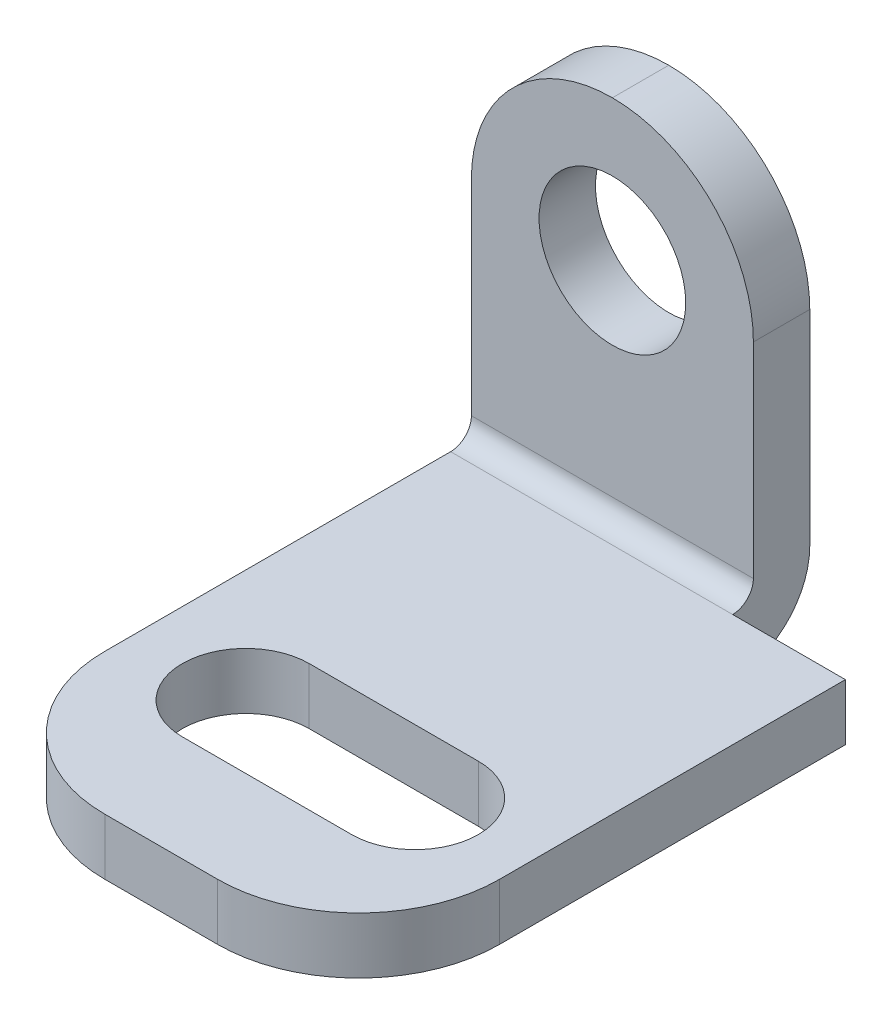
ISO-10303-21;
HEADER;
FILE_DESCRIPTION(('STEP AP214'),'2;1');
FILE_NAME('part.step','',(''),(''),'','','');
FILE_SCHEMA(('AUTOMOTIVE_DESIGN { 1 0 10303 214 1 1 1 1 }'));
ENDSEC;
DATA;
#1=APPLICATION_CONTEXT('core data for automotive mechanical design processes');
#2=APPLICATION_PROTOCOL_DEFINITION('international standard','automotive_design',2000,#1);
#3=PRODUCT_CONTEXT('',#1,'mechanical');
#4=PRODUCT('Part','Part','',(#3));
#5=PRODUCT_RELATED_PRODUCT_CATEGORY('part','',(#4));
#6=PRODUCT_DEFINITION_FORMATION('','',#4);
#7=PRODUCT_DEFINITION_CONTEXT('part definition',#1,'design');
#8=PRODUCT_DEFINITION('design','',#6,#7);
#9=PRODUCT_DEFINITION_SHAPE('','',#8);
#10=(LENGTH_UNIT() NAMED_UNIT(*) SI_UNIT(.MILLI.,.METRE.));
#11=(NAMED_UNIT(*) PLANE_ANGLE_UNIT() SI_UNIT($,.RADIAN.));
#12=(NAMED_UNIT(*) SI_UNIT($,.STERADIAN.) SOLID_ANGLE_UNIT());
#13=UNCERTAINTY_MEASURE_WITH_UNIT(LENGTH_MEASURE(1.E-05),#10,'distance_accuracy_value','');
#14=(GEOMETRIC_REPRESENTATION_CONTEXT(3) GLOBAL_UNCERTAINTY_ASSIGNED_CONTEXT((#13)) GLOBAL_UNIT_ASSIGNED_CONTEXT((#10,
#11,#12)) REPRESENTATION_CONTEXT('',''));
#15=CARTESIAN_POINT('',(0.,0.,0.));
#16=DIRECTION('',(0.,0.,1.));
#17=DIRECTION('',(1.,0.,0.));
#18=AXIS2_PLACEMENT_3D('',#15,#16,#17);
#19=CARTESIAN_POINT('',(7.,2.7366,2.));
#20=DIRECTION('',(1.,0.,0.));
#21=DIRECTION('',(0.,0.,-1.));
#22=AXIS2_PLACEMENT_3D('',#19,#20,#21);
#23=PLANE('',#22);
#24=DIRECTION('',(0.,0.,-1.));
#25=VECTOR('',#24,1.);
#26=CARTESIAN_POINT('',(7.,2.,20.));
#27=LINE('',#26,#25);
#28=CARTESIAN_POINT('',(7.,2.,15.));
#29=VERTEX_POINT('',#28);
#30=CARTESIAN_POINT('',(7.,2.,2.7366));
#31=VERTEX_POINT('',#30);
#32=EDGE_CURVE('E154',#29,#31,#27,.T.);
#33=ORIENTED_EDGE('',*,*,#32,.F.);
#34=DIRECTION('',(0.,1.,0.));
#35=VECTOR('',#34,1.);
#36=CARTESIAN_POINT('',(7.,2.7366,15.));
#37=LINE('',#36,#35);
#38=CARTESIAN_POINT('',(7.,0.,15.));
#39=VERTEX_POINT('',#38);
#40=EDGE_CURVE('E43',#29,#39,#37,.F.);
#41=ORIENTED_EDGE('',*,*,#40,.T.);
#42=DIRECTION('',(0.,0.,-1.));
#43=VECTOR('',#42,1.);
#44=CARTESIAN_POINT('',(7.,0.,20.));
#45=LINE('',#44,#43);
#46=CARTESIAN_POINT('',(7.,0.,2.7366));
#47=VERTEX_POINT('',#46);
#48=EDGE_CURVE('E147',#39,#47,#45,.T.);
#49=ORIENTED_EDGE('',*,*,#48,.T.);
#50=DIRECTION('',(0.,1.,0.));
#51=VECTOR('',#50,1.);
#52=CARTESIAN_POINT('',(7.,0.,2.7366));
#53=LINE('',#52,#51);
#54=EDGE_CURVE('E149',#47,#31,#53,.T.);
#55=ORIENTED_EDGE('',*,*,#54,.T.);
#56=EDGE_LOOP('',(#33,#41,#49,#55));
#57=FACE_BOUND('',#56,.T.);
#58=ADVANCED_FACE('F34',(#57),#23,.T.);
#59=CARTESIAN_POINT('',(-7.,2.7366,0.));
#60=DIRECTION('',(-1.,0.,0.));
#61=DIRECTION('',(0.,0.,1.));
#62=AXIS2_PLACEMENT_3D('',#59,#60,#61);
#63=PLANE('',#62);
#64=DIRECTION('',(0.,0.,1.));
#65=VECTOR('',#64,1.);
#66=CARTESIAN_POINT('',(-7.,2.7366,0.));
#67=LINE('',#66,#65);
#68=CARTESIAN_POINT('',(-7.,2.7366,0.));
#69=VERTEX_POINT('',#68);
#70=CARTESIAN_POINT('',(-7.,2.7366,2.));
#71=VERTEX_POINT('',#70);
#72=EDGE_CURVE('E166',#69,#71,#67,.T.);
#73=ORIENTED_EDGE('',*,*,#72,.F.);
#74=CARTESIAN_POINT('',(-7.,2.7366,2.7366));
#75=DIRECTION('',(-1.,0.,0.));
#76=DIRECTION('',(0.,0.,1.));
#77=AXIS2_PLACEMENT_3D('',#74,#75,#76);
#78=CIRCLE('',#77,2.7366);
#79=CARTESIAN_POINT('',(-7.,0.,2.7366));
#80=VERTEX_POINT('',#79);
#81=EDGE_CURVE('E226',#80,#69,#78,.F.);
#82=ORIENTED_EDGE('',*,*,#81,.F.);
#83=DIRECTION('',(0.,-1.,0.));
#84=VECTOR('',#83,1.);
#85=CARTESIAN_POINT('',(-7.,2.,2.7366));
#86=LINE('',#85,#84);
#87=CARTESIAN_POINT('',(-7.,2.,2.7366));
#88=VERTEX_POINT('',#87);
#89=EDGE_CURVE('E184',#88,#80,#86,.T.);
#90=ORIENTED_EDGE('',*,*,#89,.F.);
#91=CARTESIAN_POINT('',(-7.,2.7366,2.7366));
#92=DIRECTION('',(1.,0.,0.));
#93=DIRECTION('',(0.,0.,-1.));
#94=AXIS2_PLACEMENT_3D('',#91,#92,#93);
#95=CIRCLE('',#94,0.7366);
#96=EDGE_CURVE('E250',#88,#71,#95,.T.);
#97=ORIENTED_EDGE('',*,*,#96,.T.);
#98=EDGE_LOOP('',(#73,#82,#90,#97));
#99=FACE_BOUND('',#98,.T.);
#100=ADVANCED_FACE('F259',(#99),#63,.T.);
#101=CARTESIAN_POINT('',(-7.,2.,2.7366));
#102=DIRECTION('',(-1.,0.,0.));
#103=DIRECTION('',(0.,0.,1.));
#104=AXIS2_PLACEMENT_3D('',#101,#102,#103);
#105=PLANE('',#104);
#106=DIRECTION('',(0.,1.,0.));
#107=VECTOR('',#106,1.);
#108=CARTESIAN_POINT('',(-7.,0.,2.));
#109=LINE('',#108,#107);
#110=CARTESIAN_POINT('',(-7.,10.,2.));
#111=VERTEX_POINT('',#110);
#112=EDGE_CURVE('E246',#71,#111,#109,.T.);
#113=ORIENTED_EDGE('',*,*,#112,.T.);
#114=DIRECTION('',(0.,0.,-1.));
#115=VECTOR('',#114,1.);
#116=CARTESIAN_POINT('',(-7.,10.,2.7366));
#117=LINE('',#116,#115);
#118=CARTESIAN_POINT('',(-7.,10.,0.));
#119=VERTEX_POINT('',#118);
#120=EDGE_CURVE('E190',#111,#119,#117,.T.);
#121=ORIENTED_EDGE('',*,*,#120,.T.);
#122=DIRECTION('',(0.,1.,0.));
#123=VECTOR('',#122,1.);
#124=CARTESIAN_POINT('',(-7.,0.,0.));
#125=LINE('',#124,#123);
#126=EDGE_CURVE('E243',#69,#119,#125,.T.);
#127=ORIENTED_EDGE('',*,*,#126,.F.);
#128=ORIENTED_EDGE('',*,*,#72,.T.);
#129=EDGE_LOOP('',(#113,#121,#127,#128));
#130=FACE_BOUND('',#129,.T.);
#131=ADVANCED_FACE('F268',(#130),#105,.T.);
#132=CARTESIAN_POINT('',(7.,0.,0.));
#133=DIRECTION('',(0.,0.,1.));
#134=DIRECTION('',(1.,0.,0.));
#135=AXIS2_PLACEMENT_3D('',#132,#133,#134);
#136=PLANE('',#135);
#137=CARTESIAN_POINT('',(-2.,10.,0.));
#138=DIRECTION('',(0.,0.,1.));
#139=DIRECTION('',(1.,0.,0.));
#140=AXIS2_PLACEMENT_3D('',#137,#138,#139);
#141=CIRCLE('',#140,2.6);
#142=CARTESIAN_POINT('',(0.599999999999999,10.,0.));
#143=VERTEX_POINT('',#142);
#144=EDGE_CURVE('E549',#143,#143,#141,.T.);
#145=ORIENTED_EDGE('',*,*,#144,.T.);
#146=EDGE_LOOP('',(#145));
#147=FACE_BOUND('',#146,.T.);
#148=ORIENTED_EDGE('',*,*,#126,.T.);
#149=CARTESIAN_POINT('',(-2.,10.,0.));
#150=DIRECTION('',(0.,0.,1.));
#151=DIRECTION('',(1.,0.,0.));
#152=AXIS2_PLACEMENT_3D('',#149,#150,#151);
#153=CIRCLE('',#152,5.);
#154=CARTESIAN_POINT('',(-2.,15.,0.));
#155=VERTEX_POINT('',#154);
#156=EDGE_CURVE('E195',#119,#155,#153,.F.);
#157=ORIENTED_EDGE('',*,*,#156,.T.);
#158=CARTESIAN_POINT('',(-2.,10.,0.));
#159=DIRECTION('',(0.,0.,1.));
#160=DIRECTION('',(1.,0.,0.));
#161=AXIS2_PLACEMENT_3D('',#158,#159,#160);
#162=CIRCLE('',#161,5.);
#163=CARTESIAN_POINT('',(3.,10.,0.));
#164=VERTEX_POINT('',#163);
#165=EDGE_CURVE('E193',#155,#164,#162,.F.);
#166=ORIENTED_EDGE('',*,*,#165,.T.);
#167=DIRECTION('',(0.,-1.,0.));
#168=VECTOR('',#167,1.);
#169=CARTESIAN_POINT('',(3.,15.,0.));
#170=LINE('',#169,#168);
#171=CARTESIAN_POINT('',(3.,2.7366,0.));
#172=VERTEX_POINT('',#171);
#173=EDGE_CURVE('E282',#164,#172,#170,.T.);
#174=ORIENTED_EDGE('',*,*,#173,.T.);
#175=DIRECTION('',(-1.,0.,0.));
#176=VECTOR('',#175,1.);
#177=CARTESIAN_POINT('',(7.,2.7366,0.));
#178=LINE('',#177,#176);
#179=EDGE_CURVE('E153',#172,#69,#178,.T.);
#180=ORIENTED_EDGE('',*,*,#179,.T.);
#181=EDGE_LOOP('',(#148,#157,#166,#174,#180));
#182=FACE_BOUND('',#181,.T.);
#183=ADVANCED_FACE('F278',(#147,#182),#136,.F.);
#184=CARTESIAN_POINT('',(7.,0.,2.));
#185=DIRECTION('',(0.,0.,1.));
#186=DIRECTION('',(1.,0.,0.));
#187=AXIS2_PLACEMENT_3D('',#184,#185,#186);
#188=PLANE('',#187);
#189=CARTESIAN_POINT('',(-2.,10.,2.));
#190=DIRECTION('',(0.,0.,1.));
#191=DIRECTION('',(1.,0.,0.));
#192=AXIS2_PLACEMENT_3D('',#189,#190,#191);
#193=CIRCLE('',#192,2.6);
#194=CARTESIAN_POINT('',(0.599999999999999,10.,2.));
#195=VERTEX_POINT('',#194);
#196=EDGE_CURVE('E548',#195,#195,#193,.T.);
#197=ORIENTED_EDGE('',*,*,#196,.F.);
#198=EDGE_LOOP('',(#197));
#199=FACE_BOUND('',#198,.T.);
#200=CARTESIAN_POINT('',(-2.,10.,2.));
#201=DIRECTION('',(0.,0.,1.));
#202=DIRECTION('',(1.,0.,0.));
#203=AXIS2_PLACEMENT_3D('',#200,#201,#202);
#204=CIRCLE('',#203,5.);
#205=CARTESIAN_POINT('',(3.,10.,2.));
#206=VERTEX_POINT('',#205);
#207=CARTESIAN_POINT('',(-2.,15.,2.));
#208=VERTEX_POINT('',#207);
#209=EDGE_CURVE('E197',#206,#208,#204,.T.);
#210=ORIENTED_EDGE('',*,*,#209,.T.);
#211=CARTESIAN_POINT('',(-2.,10.,2.));
#212=DIRECTION('',(0.,0.,1.));
#213=DIRECTION('',(1.,0.,0.));
#214=AXIS2_PLACEMENT_3D('',#211,#212,#213);
#215=CIRCLE('',#214,5.);
#216=EDGE_CURVE('E199',#208,#111,#215,.T.);
#217=ORIENTED_EDGE('',*,*,#216,.T.);
#218=ORIENTED_EDGE('',*,*,#112,.F.);
#219=DIRECTION('',(-1.,0.,0.));
#220=VECTOR('',#219,1.);
#221=CARTESIAN_POINT('',(7.,2.7366,2.));
#222=LINE('',#221,#220);
#223=CARTESIAN_POINT('',(3.,2.7366,2.));
#224=VERTEX_POINT('',#223);
#225=EDGE_CURVE('E182',#224,#71,#222,.T.);
#226=ORIENTED_EDGE('',*,*,#225,.F.);
#227=DIRECTION('',(0.,-1.,0.));
#228=VECTOR('',#227,1.);
#229=CARTESIAN_POINT('',(3.,0.,2.));
#230=LINE('',#229,#228);
#231=EDGE_CURVE('E291',#206,#224,#230,.T.);
#232=ORIENTED_EDGE('',*,*,#231,.F.);
#233=EDGE_LOOP('',(#210,#217,#218,#226,#232));
#234=FACE_BOUND('',#233,.T.);
#235=ADVANCED_FACE('F270',(#199,#234),#188,.T.);
#236=CARTESIAN_POINT('',(7.,2.7366,2.7366));
#237=DIRECTION('',(-1.,0.,0.));
#238=DIRECTION('',(0.,0.,1.));
#239=AXIS2_PLACEMENT_3D('',#236,#237,#238);
#240=CYLINDRICAL_SURFACE('',#239,0.7366);
#241=CARTESIAN_POINT('',(3.,2.7366,2.7366));
#242=DIRECTION('',(-1.,0.,0.));
#243=DIRECTION('',(0.,0.,1.));
#244=AXIS2_PLACEMENT_3D('',#241,#242,#243);
#245=CIRCLE('',#244,0.7366);
#246=CARTESIAN_POINT('',(3.,2.,2.7366));
#247=VERTEX_POINT('',#246);
#248=EDGE_CURVE('E262',#224,#247,#245,.T.);
#249=ORIENTED_EDGE('',*,*,#248,.F.);
#250=ORIENTED_EDGE('',*,*,#225,.T.);
#251=ORIENTED_EDGE('',*,*,#96,.F.);
#252=DIRECTION('',(-1.,0.,0.));
#253=VECTOR('',#252,1.);
#254=CARTESIAN_POINT('',(7.,2.,2.7366));
#255=LINE('',#254,#253);
#256=EDGE_CURVE('E180',#247,#88,#255,.T.);
#257=ORIENTED_EDGE('',*,*,#256,.F.);
#258=EDGE_LOOP('',(#249,#250,#251,#257));
#259=FACE_BOUND('',#258,.T.);
#260=ADVANCED_FACE('F260',(#259),#240,.F.);
#261=CARTESIAN_POINT('',(7.,2.,20.));
#262=DIRECTION('',(0.,1.,0.));
#263=DIRECTION('',(0.,0.,1.));
#264=AXIS2_PLACEMENT_3D('',#261,#262,#263);
#265=PLANE('',#264);
#266=CARTESIAN_POINT('',(-3.,2.,14.));
#267=DIRECTION('',(0.,1.,0.));
#268=DIRECTION('',(0.,0.,1.));
#269=AXIS2_PLACEMENT_3D('',#266,#267,#268);
#270=CIRCLE('',#269,2.25);
#271=CARTESIAN_POINT('',(-3.,2.,11.75));
#272=VERTEX_POINT('',#271);
#273=CARTESIAN_POINT('',(-3.,2.,16.25));
#274=VERTEX_POINT('',#273);
#275=EDGE_CURVE('E297',#272,#274,#270,.T.);
#276=ORIENTED_EDGE('',*,*,#275,.F.);
#277=DIRECTION('',(-1.,0.,0.));
#278=VECTOR('',#277,1.);
#279=CARTESIAN_POINT('',(-3.,2.,11.75));
#280=LINE('',#279,#278);
#281=CARTESIAN_POINT('',(3.,2.,11.75));
#282=VERTEX_POINT('',#281);
#283=EDGE_CURVE('E302',#282,#272,#280,.T.);
#284=ORIENTED_EDGE('',*,*,#283,.F.);
#285=CARTESIAN_POINT('',(3.,2.,14.));
#286=DIRECTION('',(0.,1.,0.));
#287=DIRECTION('',(0.,0.,1.));
#288=AXIS2_PLACEMENT_3D('',#285,#286,#287);
#289=CIRCLE('',#288,2.25);
#290=CARTESIAN_POINT('',(3.,2.,16.25));
#291=VERTEX_POINT('',#290);
#292=EDGE_CURVE('E315',#291,#282,#289,.T.);
#293=ORIENTED_EDGE('',*,*,#292,.F.);
#294=DIRECTION('',(1.,0.,0.));
#295=VECTOR('',#294,1.);
#296=CARTESIAN_POINT('',(-3.,2.,16.25));
#297=LINE('',#296,#295);
#298=EDGE_CURVE('E312',#274,#291,#297,.T.);
#299=ORIENTED_EDGE('',*,*,#298,.F.);
#300=EDGE_LOOP('',(#276,#284,#293,#299));
#301=FACE_BOUND('',#300,.T.);
#302=DIRECTION('',(0.,0.,-1.));
#303=VECTOR('',#302,1.);
#304=CARTESIAN_POINT('',(-7.,2.,20.));
#305=LINE('',#304,#303);
#306=CARTESIAN_POINT('',(-7.,2.,15.));
#307=VERTEX_POINT('',#306);
#308=EDGE_CURVE('E227',#307,#88,#305,.T.);
#309=ORIENTED_EDGE('',*,*,#308,.F.);
#310=CARTESIAN_POINT('',(-2.,2.,15.));
#311=DIRECTION('',(0.,1.,0.));
#312=DIRECTION('',(0.,0.,1.));
#313=AXIS2_PLACEMENT_3D('',#310,#311,#312);
#314=CIRCLE('',#313,5.);
#315=CARTESIAN_POINT('',(-2.,2.,20.));
#316=VERTEX_POINT('',#315);
#317=EDGE_CURVE('E206',#307,#316,#314,.T.);
#318=ORIENTED_EDGE('',*,*,#317,.T.);
#319=DIRECTION('',(-1.,0.,0.));
#320=VECTOR('',#319,1.);
#321=CARTESIAN_POINT('',(7.,2.,20.));
#322=LINE('',#321,#320);
#323=CARTESIAN_POINT('',(2.,2.,20.));
#324=VERTEX_POINT('',#323);
#325=EDGE_CURVE('E174',#324,#316,#322,.T.);
#326=ORIENTED_EDGE('',*,*,#325,.F.);
#327=CARTESIAN_POINT('',(2.,2.,15.));
#328=DIRECTION('',(0.,1.,0.));
#329=DIRECTION('',(0.,0.,1.));
#330=AXIS2_PLACEMENT_3D('',#327,#328,#329);
#331=CIRCLE('',#330,5.);
#332=EDGE_CURVE('E204',#324,#29,#331,.T.);
#333=ORIENTED_EDGE('',*,*,#332,.T.);
#334=ORIENTED_EDGE('',*,*,#32,.T.);
#335=EDGE_CURVE('E164',#31,#247,#255,.T.);
#336=ORIENTED_EDGE('',*,*,#335,.T.);
#337=ORIENTED_EDGE('',*,*,#256,.T.);
#338=EDGE_LOOP('',(#309,#318,#326,#333,#334,#336,#337));
#339=FACE_BOUND('',#338,.T.);
#340=ADVANCED_FACE('F232',(#301,#339),#265,.T.);
#341=CARTESIAN_POINT('',(7.,0.,20.));
#342=DIRECTION('',(0.,0.,1.));
#343=DIRECTION('',(1.,0.,0.));
#344=AXIS2_PLACEMENT_3D('',#341,#342,#343);
#345=PLANE('',#344);
#346=ORIENTED_EDGE('',*,*,#325,.T.);
#347=DIRECTION('',(0.,1.,0.));
#348=VECTOR('',#347,1.);
#349=CARTESIAN_POINT('',(-2.,0.,20.));
#350=LINE('',#349,#348);
#351=CARTESIAN_POINT('',(-2.,0.,20.));
#352=VERTEX_POINT('',#351);
#353=EDGE_CURVE('E57',#316,#352,#350,.F.);
#354=ORIENTED_EDGE('',*,*,#353,.T.);
#355=DIRECTION('',(-1.,0.,0.));
#356=VECTOR('',#355,1.);
#357=CARTESIAN_POINT('',(7.,0.,20.));
#358=LINE('',#357,#356);
#359=CARTESIAN_POINT('',(2.,0.,20.));
#360=VERTEX_POINT('',#359);
#361=EDGE_CURVE('E172',#360,#352,#358,.T.);
#362=ORIENTED_EDGE('',*,*,#361,.F.);
#363=DIRECTION('',(0.,1.,0.));
#364=VECTOR('',#363,1.);
#365=CARTESIAN_POINT('',(2.,0.,20.));
#366=LINE('',#365,#364);
#367=EDGE_CURVE('E208',#360,#324,#366,.T.);
#368=ORIENTED_EDGE('',*,*,#367,.T.);
#369=EDGE_LOOP('',(#346,#354,#362,#368));
#370=FACE_BOUND('',#369,.T.);
#371=ADVANCED_FACE('F234',(#370),#345,.T.);
#372=CARTESIAN_POINT('',(7.,0.,20.));
#373=DIRECTION('',(0.,1.,0.));
#374=DIRECTION('',(0.,0.,1.));
#375=AXIS2_PLACEMENT_3D('',#372,#373,#374);
#376=PLANE('',#375);
#377=DIRECTION('',(-1.,0.,0.));
#378=VECTOR('',#377,1.);
#379=CARTESIAN_POINT('',(-3.,0.,11.75));
#380=LINE('',#379,#378);
#381=CARTESIAN_POINT('',(3.,0.,11.75));
#382=VERTEX_POINT('',#381);
#383=CARTESIAN_POINT('',(-3.,0.,11.75));
#384=VERTEX_POINT('',#383);
#385=EDGE_CURVE('E308',#382,#384,#380,.T.);
#386=ORIENTED_EDGE('',*,*,#385,.T.);
#387=CARTESIAN_POINT('',(-3.,0.,14.));
#388=DIRECTION('',(0.,1.,0.));
#389=DIRECTION('',(0.,0.,1.));
#390=AXIS2_PLACEMENT_3D('',#387,#388,#389);
#391=CIRCLE('',#390,2.25);
#392=CARTESIAN_POINT('',(-3.,0.,16.25));
#393=VERTEX_POINT('',#392);
#394=EDGE_CURVE('E298',#384,#393,#391,.T.);
#395=ORIENTED_EDGE('',*,*,#394,.T.);
#396=DIRECTION('',(1.,0.,0.));
#397=VECTOR('',#396,1.);
#398=CARTESIAN_POINT('',(-3.,0.,16.25));
#399=LINE('',#398,#397);
#400=CARTESIAN_POINT('',(3.,0.,16.25));
#401=VERTEX_POINT('',#400);
#402=EDGE_CURVE('E301',#393,#401,#399,.T.);
#403=ORIENTED_EDGE('',*,*,#402,.T.);
#404=CARTESIAN_POINT('',(3.,0.,14.));
#405=DIRECTION('',(0.,1.,0.));
#406=DIRECTION('',(0.,0.,1.));
#407=AXIS2_PLACEMENT_3D('',#404,#405,#406);
#408=CIRCLE('',#407,2.25);
#409=EDGE_CURVE('E305',#401,#382,#408,.T.);
#410=ORIENTED_EDGE('',*,*,#409,.T.);
#411=EDGE_LOOP('',(#386,#395,#403,#410));
#412=FACE_BOUND('',#411,.T.);
#413=ORIENTED_EDGE('',*,*,#361,.T.);
#414=CARTESIAN_POINT('',(-2.,0.,15.));
#415=DIRECTION('',(0.,1.,0.));
#416=DIRECTION('',(0.,0.,1.));
#417=AXIS2_PLACEMENT_3D('',#414,#415,#416);
#418=CIRCLE('',#417,5.);
#419=CARTESIAN_POINT('',(-7.,0.,15.));
#420=VERTEX_POINT('',#419);
#421=EDGE_CURVE('E214',#352,#420,#418,.F.);
#422=ORIENTED_EDGE('',*,*,#421,.T.);
#423=DIRECTION('',(0.,0.,-1.));
#424=VECTOR('',#423,1.);
#425=CARTESIAN_POINT('',(-7.,0.,20.));
#426=LINE('',#425,#424);
#427=EDGE_CURVE('E218',#420,#80,#426,.T.);
#428=ORIENTED_EDGE('',*,*,#427,.T.);
#429=DIRECTION('',(-1.,0.,0.));
#430=VECTOR('',#429,1.);
#431=CARTESIAN_POINT('',(7.,0.,2.7366));
#432=LINE('',#431,#430);
#433=CARTESIAN_POINT('',(3.,0.,2.7366));
#434=VERTEX_POINT('',#433);
#435=EDGE_CURVE('E171',#434,#80,#432,.T.);
#436=ORIENTED_EDGE('',*,*,#435,.F.);
#437=EDGE_CURVE('E161',#47,#434,#432,.T.);
#438=ORIENTED_EDGE('',*,*,#437,.F.);
#439=ORIENTED_EDGE('',*,*,#48,.F.);
#440=CARTESIAN_POINT('',(2.,0.,15.));
#441=DIRECTION('',(0.,1.,0.));
#442=DIRECTION('',(0.,0.,1.));
#443=AXIS2_PLACEMENT_3D('',#440,#441,#442);
#444=CIRCLE('',#443,5.);
#445=EDGE_CURVE('E212',#39,#360,#444,.F.);
#446=ORIENTED_EDGE('',*,*,#445,.T.);
#447=EDGE_LOOP('',(#413,#422,#428,#436,#438,#439,#446));
#448=FACE_BOUND('',#447,.T.);
#449=ADVANCED_FACE('F169',(#412,#448),#376,.F.);
#450=CARTESIAN_POINT('',(7.,2.7366,2.7366));
#451=DIRECTION('',(-1.,0.,0.));
#452=DIRECTION('',(0.,0.,1.));
#453=AXIS2_PLACEMENT_3D('',#450,#451,#452);
#454=CYLINDRICAL_SURFACE('',#453,2.7366);
#455=ORIENTED_EDGE('',*,*,#179,.F.);
#456=CARTESIAN_POINT('',(3.,2.7366,2.7366));
#457=DIRECTION('',(-1.,0.,0.));
#458=DIRECTION('',(0.,0.,1.));
#459=AXIS2_PLACEMENT_3D('',#456,#457,#458);
#460=CIRCLE('',#459,2.7366);
#461=EDGE_CURVE('E165',#172,#434,#460,.T.);
#462=ORIENTED_EDGE('',*,*,#461,.T.);
#463=ORIENTED_EDGE('',*,*,#435,.T.);
#464=ORIENTED_EDGE('',*,*,#81,.T.);
#465=EDGE_LOOP('',(#455,#462,#463,#464));
#466=FACE_BOUND('',#465,.T.);
#467=ADVANCED_FACE('F285',(#466),#454,.T.);
#468=CARTESIAN_POINT('',(-7.,2.7366,2.7366));
#469=DIRECTION('',(1.,0.,0.));
#470=DIRECTION('',(0.,0.,-1.));
#471=AXIS2_PLACEMENT_3D('',#468,#469,#470);
#472=PLANE('',#471);
#473=ORIENTED_EDGE('',*,*,#427,.F.);
#474=DIRECTION('',(0.,1.,0.));
#475=VECTOR('',#474,1.);
#476=CARTESIAN_POINT('',(-7.,2.,15.));
#477=LINE('',#476,#475);
#478=EDGE_CURVE('E201',#420,#307,#477,.T.);
#479=ORIENTED_EDGE('',*,*,#478,.T.);
#480=ORIENTED_EDGE('',*,*,#308,.T.);
#481=ORIENTED_EDGE('',*,*,#89,.T.);
#482=EDGE_LOOP('',(#473,#479,#480,#481));
#483=FACE_BOUND('',#482,.T.);
#484=ADVANCED_FACE('F222',(#483),#472,.F.);
#485=CARTESIAN_POINT('',(-3.,0.,14.));
#486=DIRECTION('',(0.,1.,0.));
#487=DIRECTION('',(0.,0.,1.));
#488=AXIS2_PLACEMENT_3D('',#485,#486,#487);
#489=CYLINDRICAL_SURFACE('',#488,2.25);
#490=ORIENTED_EDGE('',*,*,#275,.T.);
#491=DIRECTION('',(0.,1.,0.));
#492=VECTOR('',#491,1.);
#493=CARTESIAN_POINT('',(-3.,0.,16.25));
#494=LINE('',#493,#492);
#495=EDGE_CURVE('E240',#393,#274,#494,.T.);
#496=ORIENTED_EDGE('',*,*,#495,.F.);
#497=ORIENTED_EDGE('',*,*,#394,.F.);
#498=DIRECTION('',(0.,1.,0.));
#499=VECTOR('',#498,1.);
#500=CARTESIAN_POINT('',(-3.,0.,11.75));
#501=LINE('',#500,#499);
#502=EDGE_CURVE('E247',#384,#272,#501,.T.);
#503=ORIENTED_EDGE('',*,*,#502,.T.);
#504=EDGE_LOOP('',(#490,#496,#497,#503));
#505=FACE_BOUND('',#504,.T.);
#506=ADVANCED_FACE('F341',(#505),#489,.F.);
#507=CARTESIAN_POINT('',(-3.,0.,11.75));
#508=DIRECTION('',(0.,0.,-1.));
#509=DIRECTION('',(-1.,0.,0.));
#510=AXIS2_PLACEMENT_3D('',#507,#508,#509);
#511=PLANE('',#510);
#512=ORIENTED_EDGE('',*,*,#283,.T.);
#513=ORIENTED_EDGE('',*,*,#502,.F.);
#514=ORIENTED_EDGE('',*,*,#385,.F.);
#515=DIRECTION('',(0.,1.,0.));
#516=VECTOR('',#515,1.);
#517=CARTESIAN_POINT('',(3.,0.,11.75));
#518=LINE('',#517,#516);
#519=EDGE_CURVE('E321',#382,#282,#518,.T.);
#520=ORIENTED_EDGE('',*,*,#519,.T.);
#521=EDGE_LOOP('',(#512,#513,#514,#520));
#522=FACE_BOUND('',#521,.T.);
#523=ADVANCED_FACE('F339',(#522),#511,.F.);
#524=CARTESIAN_POINT('',(3.,0.,14.));
#525=DIRECTION('',(0.,1.,0.));
#526=DIRECTION('',(0.,0.,1.));
#527=AXIS2_PLACEMENT_3D('',#524,#525,#526);
#528=CYLINDRICAL_SURFACE('',#527,2.25);
#529=ORIENTED_EDGE('',*,*,#292,.T.);
#530=ORIENTED_EDGE('',*,*,#519,.F.);
#531=ORIENTED_EDGE('',*,*,#409,.F.);
#532=DIRECTION('',(0.,1.,0.));
#533=VECTOR('',#532,1.);
#534=CARTESIAN_POINT('',(3.,0.,16.25));
#535=LINE('',#534,#533);
#536=EDGE_CURVE('E322',#401,#291,#535,.T.);
#537=ORIENTED_EDGE('',*,*,#536,.T.);
#538=EDGE_LOOP('',(#529,#530,#531,#537));
#539=FACE_BOUND('',#538,.T.);
#540=ADVANCED_FACE('F336',(#539),#528,.F.);
#541=CARTESIAN_POINT('',(-3.,0.,16.25));
#542=DIRECTION('',(0.,0.,1.));
#543=DIRECTION('',(1.,0.,0.));
#544=AXIS2_PLACEMENT_3D('',#541,#542,#543);
#545=PLANE('',#544);
#546=ORIENTED_EDGE('',*,*,#298,.T.);
#547=ORIENTED_EDGE('',*,*,#536,.F.);
#548=ORIENTED_EDGE('',*,*,#402,.F.);
#549=ORIENTED_EDGE('',*,*,#495,.T.);
#550=EDGE_LOOP('',(#546,#547,#548,#549));
#551=FACE_BOUND('',#550,.T.);
#552=ADVANCED_FACE('F329',(#551),#545,.F.);
#553=CARTESIAN_POINT('',(3.,0.,0.));
#554=DIRECTION('',(-1.,0.,0.));
#555=DIRECTION('',(0.,0.,1.));
#556=AXIS2_PLACEMENT_3D('',#553,#554,#555);
#557=PLANE('',#556);
#558=ORIENTED_EDGE('',*,*,#173,.F.);
#559=DIRECTION('',(0.,0.,-1.));
#560=VECTOR('',#559,1.);
#561=CARTESIAN_POINT('',(3.,10.,2.));
#562=LINE('',#561,#560);
#563=EDGE_CURVE('E11',#164,#206,#562,.F.);
#564=ORIENTED_EDGE('',*,*,#563,.T.);
#565=ORIENTED_EDGE('',*,*,#231,.T.);
#566=ORIENTED_EDGE('',*,*,#248,.T.);
#567=DIRECTION('',(0.,1.,0.));
#568=VECTOR('',#567,1.);
#569=CARTESIAN_POINT('',(3.,15.,2.7366));
#570=LINE('',#569,#568);
#571=EDGE_CURVE('E289',#434,#247,#570,.T.);
#572=ORIENTED_EDGE('',*,*,#571,.F.);
#573=ORIENTED_EDGE('',*,*,#461,.F.);
#574=EDGE_LOOP('',(#558,#564,#565,#566,#572,#573));
#575=FACE_BOUND('',#574,.T.);
#576=ADVANCED_FACE('F287',(#575),#557,.F.);
#577=CARTESIAN_POINT('',(3.,15.,2.7366));
#578=DIRECTION('',(0.,0.,-1.));
#579=DIRECTION('',(-1.,0.,0.));
#580=AXIS2_PLACEMENT_3D('',#577,#578,#579);
#581=PLANE('',#580);
#582=ORIENTED_EDGE('',*,*,#54,.F.);
#583=ORIENTED_EDGE('',*,*,#437,.T.);
#584=ORIENTED_EDGE('',*,*,#571,.T.);
#585=ORIENTED_EDGE('',*,*,#335,.F.);
#586=EDGE_LOOP('',(#582,#583,#584,#585));
#587=FACE_BOUND('',#586,.T.);
#588=ADVANCED_FACE('F159',(#587),#581,.T.);
#589=CARTESIAN_POINT('',(-2.,10.,2.));
#590=DIRECTION('',(0.,0.,1.));
#591=DIRECTION('',(1.,0.,0.));
#592=AXIS2_PLACEMENT_3D('',#589,#590,#591);
#593=CYLINDRICAL_SURFACE('',#592,5.);
#594=DIRECTION('',(0.,0.,-1.));
#595=VECTOR('',#594,1.);
#596=CARTESIAN_POINT('',(-2.,15.,0.));
#597=LINE('',#596,#595);
#598=EDGE_CURVE('E38',#208,#155,#597,.T.);
#599=ORIENTED_EDGE('',*,*,#598,.F.);
#600=ORIENTED_EDGE('',*,*,#209,.F.);
#601=ORIENTED_EDGE('',*,*,#563,.F.);
#602=ORIENTED_EDGE('',*,*,#165,.F.);
#603=EDGE_LOOP('',(#599,#600,#601,#602));
#604=FACE_BOUND('',#603,.T.);
#605=ADVANCED_FACE('F361',(#604),#593,.T.);
#606=CARTESIAN_POINT('',(-2.,10.,2.7366));
#607=DIRECTION('',(0.,0.,-1.));
#608=DIRECTION('',(-1.,0.,0.));
#609=AXIS2_PLACEMENT_3D('',#606,#607,#608);
#610=CYLINDRICAL_SURFACE('',#609,5.);
#611=ORIENTED_EDGE('',*,*,#216,.F.);
#612=ORIENTED_EDGE('',*,*,#598,.T.);
#613=ORIENTED_EDGE('',*,*,#156,.F.);
#614=ORIENTED_EDGE('',*,*,#120,.F.);
#615=EDGE_LOOP('',(#611,#612,#613,#614));
#616=FACE_BOUND('',#615,.T.);
#617=ADVANCED_FACE('F276',(#616),#610,.T.);
#618=CARTESIAN_POINT('',(-2.,2.7366,15.));
#619=DIRECTION('',(0.,-1.,0.));
#620=DIRECTION('',(0.,0.,-1.));
#621=AXIS2_PLACEMENT_3D('',#618,#619,#620);
#622=CYLINDRICAL_SURFACE('',#621,5.);
#623=ORIENTED_EDGE('',*,*,#421,.F.);
#624=ORIENTED_EDGE('',*,*,#353,.F.);
#625=ORIENTED_EDGE('',*,*,#317,.F.);
#626=ORIENTED_EDGE('',*,*,#478,.F.);
#627=EDGE_LOOP('',(#623,#624,#625,#626));
#628=FACE_BOUND('',#627,.T.);
#629=ADVANCED_FACE('F229',(#628),#622,.T.);
#630=CARTESIAN_POINT('',(2.,0.,15.));
#631=DIRECTION('',(0.,1.,0.));
#632=DIRECTION('',(0.,0.,1.));
#633=AXIS2_PLACEMENT_3D('',#630,#631,#632);
#634=CYLINDRICAL_SURFACE('',#633,5.);
#635=ORIENTED_EDGE('',*,*,#445,.F.);
#636=ORIENTED_EDGE('',*,*,#40,.F.);
#637=ORIENTED_EDGE('',*,*,#332,.F.);
#638=ORIENTED_EDGE('',*,*,#367,.F.);
#639=EDGE_LOOP('',(#635,#636,#637,#638));
#640=FACE_BOUND('',#639,.T.);
#641=ADVANCED_FACE('F36',(#640),#634,.T.);
#642=CARTESIAN_POINT('',(-2.,10.,0.));
#643=DIRECTION('',(0.,0.,1.));
#644=DIRECTION('',(1.,0.,0.));
#645=AXIS2_PLACEMENT_3D('',#642,#643,#644);
#646=CYLINDRICAL_SURFACE('',#645,2.6);
#647=ORIENTED_EDGE('',*,*,#144,.F.);
#648=EDGE_LOOP('',(#647));
#649=FACE_BOUND('',#648,.T.);
#650=ORIENTED_EDGE('',*,*,#196,.T.);
#651=EDGE_LOOP('',(#650));
#652=FACE_BOUND('',#651,.T.);
#653=ADVANCED_FACE('F368',(#649,#652),#646,.F.);
#654=CLOSED_SHELL('',(#58,#100,#131,#183,#235,#260,#340,#371,#449,#467,#484,#506,#523,#540,#552,
#576,#588,#605,#617,#629,#641,#653));
#655=MANIFOLD_SOLID_BREP('B2',#654);
#656=ADVANCED_BREP_SHAPE_REPRESENTATION('',(#18,#655),#14);
#657=SHAPE_DEFINITION_REPRESENTATION(#9,#656);
ENDSEC;
END-ISO-10303-21;
